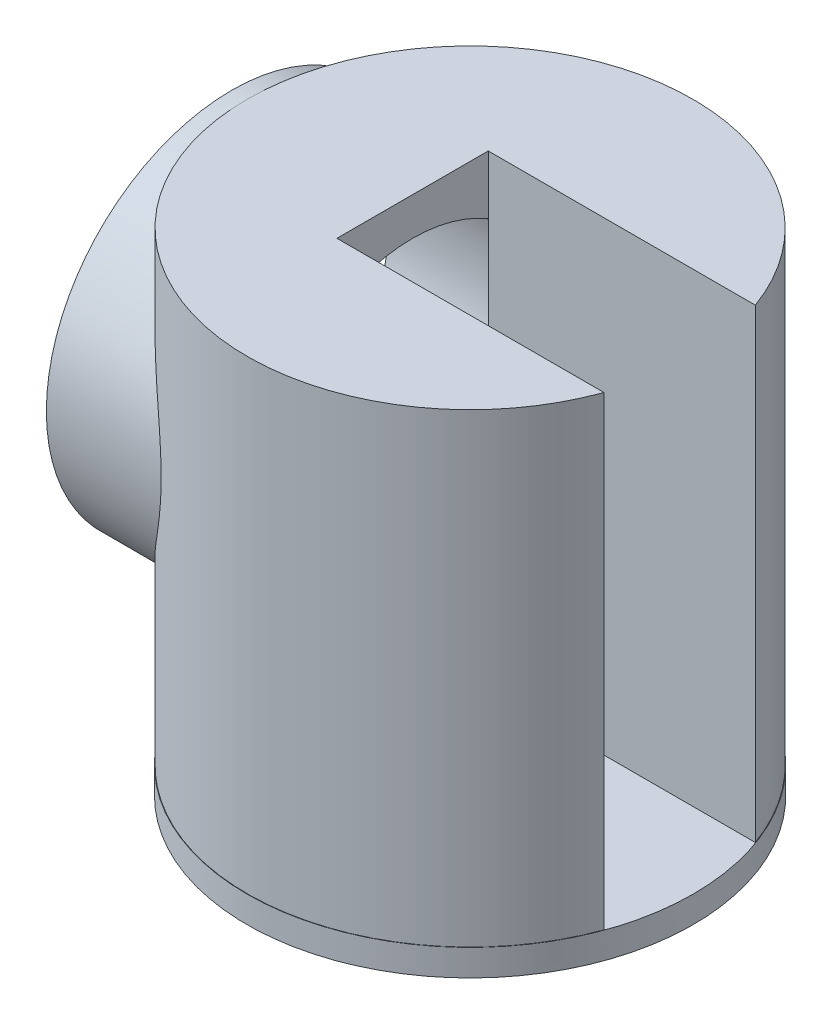
ISO-10303-21;
HEADER;
FILE_DESCRIPTION(('STEP AP214'),'2;1');
FILE_NAME('part.step','',(''),(''),'','','');
FILE_SCHEMA(('AUTOMOTIVE_DESIGN { 1 0 10303 214 1 1 1 1 }'));
ENDSEC;
DATA;
#1=APPLICATION_CONTEXT('core data for automotive mechanical design processes');
#2=APPLICATION_PROTOCOL_DEFINITION('international standard','automotive_design',2000,#1);
#3=PRODUCT_CONTEXT('',#1,'mechanical');
#4=PRODUCT('Part','Part','',(#3));
#5=PRODUCT_RELATED_PRODUCT_CATEGORY('part','',(#4));
#6=PRODUCT_DEFINITION_FORMATION('','',#4);
#7=PRODUCT_DEFINITION_CONTEXT('part definition',#1,'design');
#8=PRODUCT_DEFINITION('design','',#6,#7);
#9=PRODUCT_DEFINITION_SHAPE('','',#8);
#10=(LENGTH_UNIT() NAMED_UNIT(*) SI_UNIT(.MILLI.,.METRE.));
#11=(NAMED_UNIT(*) PLANE_ANGLE_UNIT() SI_UNIT($,.RADIAN.));
#12=(NAMED_UNIT(*) SI_UNIT($,.STERADIAN.) SOLID_ANGLE_UNIT());
#13=UNCERTAINTY_MEASURE_WITH_UNIT(LENGTH_MEASURE(1.E-05),#10,'distance_accuracy_value','');
#14=(GEOMETRIC_REPRESENTATION_CONTEXT(3) GLOBAL_UNCERTAINTY_ASSIGNED_CONTEXT((#13)) GLOBAL_UNIT_ASSIGNED_CONTEXT((#10,
#11,#12)) REPRESENTATION_CONTEXT('',''));
#15=CARTESIAN_POINT('',(0.,0.,0.));
#16=DIRECTION('',(0.,0.,1.));
#17=DIRECTION('',(1.,0.,0.));
#18=AXIS2_PLACEMENT_3D('',#15,#16,#17);
#19=CARTESIAN_POINT('',(0.,4.,0.));
#20=DIRECTION('',(0.,-1.,0.));
#21=DIRECTION('',(0.,0.,-1.));
#22=AXIS2_PLACEMENT_3D('',#19,#20,#21);
#23=CYLINDRICAL_SURFACE('',#22,29.5);
#24=CARTESIAN_POINT('',(0.,4.,0.));
#25=DIRECTION('',(0.,1.,0.));
#26=DIRECTION('',(0.,0.,1.));
#27=AXIS2_PLACEMENT_3D('',#24,#25,#26);
#28=CIRCLE('',#27,29.5);
#29=CARTESIAN_POINT('',(0.,4.,29.5));
#30=VERTEX_POINT('',#29);
#31=EDGE_CURVE('E186',#30,#30,#28,.T.);
#32=ORIENTED_EDGE('',*,*,#31,.F.);
#33=EDGE_LOOP('',(#32));
#34=FACE_BOUND('',#33,.T.);
#35=CARTESIAN_POINT('',(0.,0.5,0.));
#36=DIRECTION('',(0.,-1.,0.));
#37=DIRECTION('',(0.,0.,-1.));
#38=AXIS2_PLACEMENT_3D('',#35,#36,#37);
#39=CIRCLE('',#38,29.5);
#40=CARTESIAN_POINT('',(0.,0.5,-29.5));
#41=VERTEX_POINT('',#40);
#42=EDGE_CURVE('E241',#41,#41,#39,.T.);
#43=ORIENTED_EDGE('',*,*,#42,.F.);
#44=EDGE_LOOP('',(#43));
#45=FACE_BOUND('',#44,.T.);
#46=ADVANCED_FACE('F35',(#34,#45),#23,.T.);
#47=CARTESIAN_POINT('',(0.,0.,0.));
#48=DIRECTION('',(0.,1.,0.));
#49=DIRECTION('',(0.,0.,1.));
#50=AXIS2_PLACEMENT_3D('',#47,#48,#49);
#51=PLANE('',#50);
#52=CARTESIAN_POINT('',(7.,0.,0.));
#53=DIRECTION('',(0.,1.,0.));
#54=DIRECTION('',(0.,0.,1.));
#55=AXIS2_PLACEMENT_3D('',#52,#53,#54);
#56=CIRCLE('',#55,1.5);
#57=CARTESIAN_POINT('',(7.,0.,1.5));
#58=VERTEX_POINT('',#57);
#59=EDGE_CURVE('E183',#58,#58,#56,.T.);
#60=ORIENTED_EDGE('',*,*,#59,.T.);
#61=EDGE_LOOP('',(#60));
#62=FACE_BOUND('',#61,.T.);
#63=CARTESIAN_POINT('',(0.,0.,7.));
#64=DIRECTION('',(0.,1.,0.));
#65=DIRECTION('',(-1.,0.,0.));
#66=AXIS2_PLACEMENT_3D('',#63,#64,#65);
#67=CIRCLE('',#66,1.5);
#68=CARTESIAN_POINT('',(-1.49999999999993,0.,7.00000000000002));
#69=VERTEX_POINT('',#68);
#70=EDGE_CURVE('E171',#69,#69,#67,.T.);
#71=ORIENTED_EDGE('',*,*,#70,.T.);
#72=EDGE_LOOP('',(#71));
#73=FACE_BOUND('',#72,.T.);
#74=CARTESIAN_POINT('',(-7.,0.,0.));
#75=DIRECTION('',(0.,1.,0.));
#76=DIRECTION('',(0.,0.,-1.));
#77=AXIS2_PLACEMENT_3D('',#74,#75,#76);
#78=CIRCLE('',#77,1.5);
#79=CARTESIAN_POINT('',(-7.,0.,-1.5));
#80=VERTEX_POINT('',#79);
#81=EDGE_CURVE('E174',#80,#80,#78,.T.);
#82=ORIENTED_EDGE('',*,*,#81,.T.);
#83=EDGE_LOOP('',(#82));
#84=FACE_BOUND('',#83,.T.);
#85=CARTESIAN_POINT('',(0.,0.,-7.));
#86=DIRECTION('',(0.,1.,0.));
#87=DIRECTION('',(1.,0.,0.));
#88=AXIS2_PLACEMENT_3D('',#85,#86,#87);
#89=CIRCLE('',#88,1.5);
#90=CARTESIAN_POINT('',(1.49999999999998,0.,-7.00000000000001));
#91=VERTEX_POINT('',#90);
#92=EDGE_CURVE('E187',#91,#91,#89,.T.);
#93=ORIENTED_EDGE('',*,*,#92,.T.);
#94=EDGE_LOOP('',(#93));
#95=FACE_BOUND('',#94,.T.);
#96=CARTESIAN_POINT('',(0.,0.,0.));
#97=DIRECTION('',(0.,-1.,0.));
#98=DIRECTION('',(0.,0.,-1.));
#99=AXIS2_PLACEMENT_3D('',#96,#97,#98);
#100=CIRCLE('',#99,19.5);
#101=CARTESIAN_POINT('',(0.,0.,-19.5));
#102=VERTEX_POINT('',#101);
#103=EDGE_CURVE('E246',#102,#102,#100,.T.);
#104=ORIENTED_EDGE('',*,*,#103,.T.);
#105=EDGE_LOOP('',(#104));
#106=FACE_BOUND('',#105,.T.);
#107=ADVANCED_FACE('F230',(#62,#73,#84,#95,#106),#51,.F.);
#108=CARTESIAN_POINT('',(-7.6,4.,-10.));
#109=DIRECTION('',(-1.,0.,0.));
#110=DIRECTION('',(0.,0.,1.));
#111=AXIS2_PLACEMENT_3D('',#108,#109,#110);
#112=PLANE('',#111);
#113=DIRECTION('',(0.,1.,0.));
#114=VECTOR('',#113,1.);
#115=CARTESIAN_POINT('',(-7.6,4.,10.));
#116=LINE('',#115,#114);
#117=CARTESIAN_POINT('',(-7.6,57.7406690427832,10.));
#118=VERTEX_POINT('',#117);
#119=CARTESIAN_POINT('',(-7.6,65.5,10.));
#120=VERTEX_POINT('',#119);
#121=EDGE_CURVE('E133',#118,#120,#116,.T.);
#122=ORIENTED_EDGE('',*,*,#121,.F.);
#123=CARTESIAN_POINT('',(-7.6,41.,0.));
#124=DIRECTION('',(-1.,0.,0.));
#125=DIRECTION('',(0.,0.,1.));
#126=AXIS2_PLACEMENT_3D('',#123,#124,#125);
#127=CIRCLE('',#126,19.5);
#128=CARTESIAN_POINT('',(-7.6,57.7406690427832,-10.));
#129=VERTEX_POINT('',#128);
#130=EDGE_CURVE('E103',#129,#118,#127,.F.);
#131=ORIENTED_EDGE('',*,*,#130,.F.);
#132=DIRECTION('',(0.,1.,0.));
#133=VECTOR('',#132,1.);
#134=CARTESIAN_POINT('',(-7.6,4.,-10.));
#135=LINE('',#134,#133);
#136=CARTESIAN_POINT('',(-7.6,65.5,-10.));
#137=VERTEX_POINT('',#136);
#138=EDGE_CURVE('E118',#129,#137,#135,.T.);
#139=ORIENTED_EDGE('',*,*,#138,.T.);
#140=DIRECTION('',(0.,0.,1.));
#141=VECTOR('',#140,1.);
#142=CARTESIAN_POINT('',(-7.6,65.5,-10.));
#143=LINE('',#142,#141);
#144=EDGE_CURVE('E148',#137,#120,#143,.T.);
#145=ORIENTED_EDGE('',*,*,#144,.T.);
#146=EDGE_LOOP('',(#122,#131,#139,#145));
#147=FACE_BOUND('',#146,.T.);
#148=ADVANCED_FACE('F219',(#147),#112,.F.);
#149=CARTESIAN_POINT('',(0.,4.,0.));
#150=DIRECTION('',(0.,1.,0.));
#151=DIRECTION('',(0.,0.,1.));
#152=AXIS2_PLACEMENT_3D('',#149,#150,#151);
#153=PLANE('',#152);
#154=CARTESIAN_POINT('',(0.,4.,0.));
#155=DIRECTION('',(0.,1.,0.));
#156=DIRECTION('',(0.,0.,1.));
#157=AXIS2_PLACEMENT_3D('',#154,#155,#156);
#158=CIRCLE('',#157,29.4448697876526);
#159=CARTESIAN_POINT('',(27.6947712901157,4.,-10.));
#160=VERTEX_POINT('',#159);
#161=CARTESIAN_POINT('',(27.6947712901157,4.,10.));
#162=VERTEX_POINT('',#161);
#163=EDGE_CURVE('E192',#160,#162,#158,.T.);
#164=ORIENTED_EDGE('',*,*,#163,.F.);
#165=DIRECTION('',(-1.,0.,0.));
#166=VECTOR('',#165,1.);
#167=CARTESIAN_POINT('',(-7.6,4.,-10.));
#168=LINE('',#167,#166);
#169=CARTESIAN_POINT('',(-7.6,4.,-10.));
#170=VERTEX_POINT('',#169);
#171=EDGE_CURVE('E138',#160,#170,#168,.T.);
#172=ORIENTED_EDGE('',*,*,#171,.T.);
#173=DIRECTION('',(0.,0.,1.));
#174=VECTOR('',#173,1.);
#175=CARTESIAN_POINT('',(-7.6,4.,-10.));
#176=LINE('',#175,#174);
#177=CARTESIAN_POINT('',(-7.6,4.,-1.37477270848675));
#178=VERTEX_POINT('',#177);
#179=EDGE_CURVE('E122',#170,#178,#176,.T.);
#180=ORIENTED_EDGE('',*,*,#179,.T.);
#181=CARTESIAN_POINT('',(-7.,4.,0.));
#182=DIRECTION('',(0.,1.,0.));
#183=DIRECTION('',(0.,0.,-1.));
#184=AXIS2_PLACEMENT_3D('',#181,#182,#183);
#185=CIRCLE('',#184,1.5);
#186=CARTESIAN_POINT('',(-7.6,4.,1.37477270848675));
#187=VERTEX_POINT('',#186);
#188=EDGE_CURVE('E125',#187,#178,#185,.T.);
#189=ORIENTED_EDGE('',*,*,#188,.F.);
#190=CARTESIAN_POINT('',(-7.6,4.,10.));
#191=VERTEX_POINT('',#190);
#192=EDGE_CURVE('E152',#187,#191,#176,.T.);
#193=ORIENTED_EDGE('',*,*,#192,.T.);
#194=DIRECTION('',(1.,0.,0.));
#195=VECTOR('',#194,1.);
#196=CARTESIAN_POINT('',(-7.6,4.,10.));
#197=LINE('',#196,#195);
#198=EDGE_CURVE('E141',#191,#162,#197,.T.);
#199=ORIENTED_EDGE('',*,*,#198,.T.);
#200=EDGE_LOOP('',(#164,#172,#180,#189,#193,#199));
#201=FACE_BOUND('',#200,.T.);
#202=ORIENTED_EDGE('',*,*,#31,.T.);
#203=EDGE_LOOP('',(#202));
#204=FACE_BOUND('',#203,.T.);
#205=CARTESIAN_POINT('',(7.,4.,0.));
#206=DIRECTION('',(0.,1.,0.));
#207=DIRECTION('',(0.,0.,1.));
#208=AXIS2_PLACEMENT_3D('',#205,#206,#207);
#209=CIRCLE('',#208,1.5);
#210=CARTESIAN_POINT('',(7.,4.,1.5));
#211=VERTEX_POINT('',#210);
#212=EDGE_CURVE('E182',#211,#211,#209,.T.);
#213=ORIENTED_EDGE('',*,*,#212,.F.);
#214=EDGE_LOOP('',(#213));
#215=FACE_BOUND('',#214,.T.);
#216=CARTESIAN_POINT('',(0.,4.,7.));
#217=DIRECTION('',(0.,1.,0.));
#218=DIRECTION('',(-1.,0.,0.));
#219=AXIS2_PLACEMENT_3D('',#216,#217,#218);
#220=CIRCLE('',#219,1.5);
#221=CARTESIAN_POINT('',(-1.49999999999993,4.,7.00000000000002));
#222=VERTEX_POINT('',#221);
#223=EDGE_CURVE('E167',#222,#222,#220,.T.);
#224=ORIENTED_EDGE('',*,*,#223,.F.);
#225=EDGE_LOOP('',(#224));
#226=FACE_BOUND('',#225,.T.);
#227=CARTESIAN_POINT('',(0.,4.,-7.));
#228=DIRECTION('',(0.,1.,0.));
#229=DIRECTION('',(1.,0.,0.));
#230=AXIS2_PLACEMENT_3D('',#227,#228,#229);
#231=CIRCLE('',#230,1.5);
#232=CARTESIAN_POINT('',(1.49999999999998,4.,-7.00000000000001));
#233=VERTEX_POINT('',#232);
#234=EDGE_CURVE('E123',#233,#233,#231,.T.);
#235=ORIENTED_EDGE('',*,*,#234,.F.);
#236=EDGE_LOOP('',(#235));
#237=FACE_BOUND('',#236,.T.);
#238=ADVANCED_FACE('F160',(#201,#204,#215,#226,#237),#153,.T.);
#239=CARTESIAN_POINT('',(7.,0.,0.));
#240=DIRECTION('',(0.,1.,0.));
#241=DIRECTION('',(0.,0.,1.));
#242=AXIS2_PLACEMENT_3D('',#239,#240,#241);
#243=CYLINDRICAL_SURFACE('',#242,1.5);
#244=ORIENTED_EDGE('',*,*,#59,.F.);
#245=EDGE_LOOP('',(#244));
#246=FACE_BOUND('',#245,.T.);
#247=ORIENTED_EDGE('',*,*,#212,.T.);
#248=EDGE_LOOP('',(#247));
#249=FACE_BOUND('',#248,.T.);
#250=ADVANCED_FACE('F401',(#246,#249),#243,.F.);
#251=CARTESIAN_POINT('',(0.,0.,7.));
#252=DIRECTION('',(0.,1.,0.));
#253=DIRECTION('',(0.,0.,1.));
#254=AXIS2_PLACEMENT_3D('',#251,#252,#253);
#255=CYLINDRICAL_SURFACE('',#254,1.5);
#256=ORIENTED_EDGE('',*,*,#70,.F.);
#257=EDGE_LOOP('',(#256));
#258=FACE_BOUND('',#257,.T.);
#259=ORIENTED_EDGE('',*,*,#223,.T.);
#260=EDGE_LOOP('',(#259));
#261=FACE_BOUND('',#260,.T.);
#262=ADVANCED_FACE('F393',(#258,#261),#255,.F.);
#263=CARTESIAN_POINT('',(-7.,0.,0.));
#264=DIRECTION('',(0.,1.,0.));
#265=DIRECTION('',(0.,0.,1.));
#266=AXIS2_PLACEMENT_3D('',#263,#264,#265);
#267=CYLINDRICAL_SURFACE('',#266,1.5);
#268=ORIENTED_EDGE('',*,*,#81,.F.);
#269=EDGE_LOOP('',(#268));
#270=FACE_BOUND('',#269,.T.);
#271=EDGE_CURVE('E166',#178,#187,#185,.T.);
#272=ORIENTED_EDGE('',*,*,#271,.T.);
#273=ORIENTED_EDGE('',*,*,#188,.T.);
#274=EDGE_LOOP('',(#272,#273));
#275=FACE_BOUND('',#274,.T.);
#276=ADVANCED_FACE('F165',(#270,#275),#267,.F.);
#277=CARTESIAN_POINT('',(0.,0.,-7.));
#278=DIRECTION('',(0.,1.,0.));
#279=DIRECTION('',(0.,0.,1.));
#280=AXIS2_PLACEMENT_3D('',#277,#278,#279);
#281=CYLINDRICAL_SURFACE('',#280,1.5);
#282=ORIENTED_EDGE('',*,*,#92,.F.);
#283=EDGE_LOOP('',(#282));
#284=FACE_BOUND('',#283,.T.);
#285=ORIENTED_EDGE('',*,*,#234,.T.);
#286=EDGE_LOOP('',(#285));
#287=FACE_BOUND('',#286,.T.);
#288=ADVANCED_FACE('F222',(#284,#287),#281,.F.);
#289=CARTESIAN_POINT('',(0.,65.5,0.));
#290=DIRECTION('',(0.,1.,0.));
#291=DIRECTION('',(0.,0.,1.));
#292=AXIS2_PLACEMENT_3D('',#289,#290,#291);
#293=PLANE('',#292);
#294=DIRECTION('',(-1.,0.,0.));
#295=VECTOR('',#294,1.);
#296=CARTESIAN_POINT('',(-7.6,65.5,-10.));
#297=LINE('',#296,#295);
#298=CARTESIAN_POINT('',(27.6947712901157,65.5,-10.));
#299=VERTEX_POINT('',#298);
#300=EDGE_CURVE('E151',#299,#137,#297,.T.);
#301=ORIENTED_EDGE('',*,*,#300,.F.);
#302=CARTESIAN_POINT('',(0.,65.5,0.));
#303=DIRECTION('',(0.,1.,0.));
#304=DIRECTION('',(0.,0.,1.));
#305=AXIS2_PLACEMENT_3D('',#302,#303,#304);
#306=CIRCLE('',#305,29.4448697876526);
#307=CARTESIAN_POINT('',(-29.4448697876526,65.5,0.));
#308=VERTEX_POINT('',#307);
#309=EDGE_CURVE('E172',#299,#308,#306,.T.);
#310=ORIENTED_EDGE('',*,*,#309,.T.);
#311=CARTESIAN_POINT('',(27.6947712901157,65.5,10.));
#312=VERTEX_POINT('',#311);
#313=EDGE_CURVE('E177',#308,#312,#306,.T.);
#314=ORIENTED_EDGE('',*,*,#313,.T.);
#315=DIRECTION('',(1.,0.,0.));
#316=VECTOR('',#315,1.);
#317=CARTESIAN_POINT('',(-7.6,65.5,10.));
#318=LINE('',#317,#316);
#319=EDGE_CURVE('E150',#120,#312,#318,.T.);
#320=ORIENTED_EDGE('',*,*,#319,.F.);
#321=ORIENTED_EDGE('',*,*,#144,.F.);
#322=EDGE_LOOP('',(#301,#310,#314,#320,#321));
#323=FACE_BOUND('',#322,.T.);
#324=ADVANCED_FACE('F220',(#323),#293,.T.);
#325=CARTESIAN_POINT('',(0.,65.5,0.));
#326=DIRECTION('',(0.,-1.,0.));
#327=DIRECTION('',(0.,0.,-1.));
#328=AXIS2_PLACEMENT_3D('',#325,#326,#327);
#329=CYLINDRICAL_SURFACE('',#328,29.4448697876526);
#330=ORIENTED_EDGE('',*,*,#313,.F.);
#331=CARTESIAN_POINT('',(-16.3324938944368,41.,-24.5));
#332=CARTESIAN_POINT('',(-16.3324868350606,41.4343736320815,-24.5000027558442));
#333=CARTESIAN_POINT('',(-16.3499012151454,41.8687157237052,-24.4884219230178));
#334=CARTESIAN_POINT('',(-16.4185693250994,42.7334437832875,-24.4424350682684));
#335=CARTESIAN_POINT('',(-16.4698214758377,43.1638299349103,-24.4080301114942));
#336=CARTESIAN_POINT('',(-16.6036947655676,44.0184525116976,-24.3171579369022));
#337=CARTESIAN_POINT('',(-16.6863999678811,44.4426692657286,-24.2606315842476));
#338=CARTESIAN_POINT('',(-16.8793945321836,45.2813926967697,-24.1267517593695));
#339=CARTESIAN_POINT('',(-16.9896889415598,45.6958975818215,-24.0493944759728));
#340=CARTESIAN_POINT('',(-17.2808170345677,46.671790280637,-23.8414934266433));
#341=CARTESIAN_POINT('',(-17.4724394182634,47.2280439796226,-23.7019483076602));
#342=CARTESIAN_POINT('',(-17.889762621723,48.3175791593523,-23.3885612895738));
#343=CARTESIAN_POINT('',(-18.1154793081905,48.8508497950092,-23.2147034104909));
#344=CARTESIAN_POINT('',(-18.5921580259387,49.8957681562001,-22.8347351210409));
#345=CARTESIAN_POINT('',(-18.8431824529057,50.4073577928781,-22.6285442639849));
#346=CARTESIAN_POINT('',(-19.3622721848877,51.408174922407,-22.1860143439487));
#347=CARTESIAN_POINT('',(-19.6303368940651,51.8974031961276,-21.9496763348159));
#348=CARTESIAN_POINT('',(-20.2981591723499,53.0659149731083,-21.3370795035876));
#349=CARTESIAN_POINT('',(-20.7037756872602,53.7336734171499,-20.945133927653));
#350=CARTESIAN_POINT('',(-21.5228931517232,55.026187073332,-20.1025196774559));
#351=CARTESIAN_POINT('',(-21.9363973800578,55.6509238817724,-19.651826107676));
#352=CARTESIAN_POINT('',(-22.7591925991343,56.8563594590526,-18.6927388757427));
#353=CARTESIAN_POINT('',(-23.1684868435629,57.4370948564531,-18.1843941049612));
#354=CARTESIAN_POINT('',(-23.9729507096775,58.5528111080674,-17.1098871990638));
#355=CARTESIAN_POINT('',(-24.3681256075523,59.0878091599671,-16.5437469728538));
#356=CARTESIAN_POINT('',(-25.0537491892029,60.0002682761096,-15.4797141582886));
#357=CARTESIAN_POINT('',(-25.3486662889476,60.3871122126066,-14.9927232070239));
#358=CARTESIAN_POINT('',(-25.9192221439883,61.1273782576192,-13.9832158266857));
#359=CARTESIAN_POINT('',(-26.1948616529984,61.4808016729987,-13.4607007881078));
#360=CARTESIAN_POINT('',(-26.7217493011036,62.1505121158882,-12.3817780592763));
#361=CARTESIAN_POINT('',(-26.9730294716407,62.466848029725,-11.8254164876056));
#362=CARTESIAN_POINT('',(-27.4467639539159,63.0591498248251,-10.6798609123464));
#363=CARTESIAN_POINT('',(-27.6692234762072,63.3351230045292,-10.0906728711554));
#364=CARTESIAN_POINT('',(-28.0450386924721,63.7988802942441,-8.98639410208584));
#365=CARTESIAN_POINT('',(-28.2036960280259,63.9936658188542,-8.47604019162561));
#366=CARTESIAN_POINT('',(-28.4953431608327,64.35047747553,-7.4368596802448));
#367=CARTESIAN_POINT('',(-28.6283356607315,64.512507057059,-6.90803503132672));
#368=CARTESIAN_POINT('',(-28.8661785952631,64.8015261924595,-5.83489469012575));
#369=CARTESIAN_POINT('',(-28.9710398762782,64.9285292518244,-5.29058505808388));
#370=CARTESIAN_POINT('',(-29.1506029507561,65.1456211584113,-4.18971358350554));
#371=CARTESIAN_POINT('',(-29.2253043966333,65.2357095802003,-3.63315159984133));
#372=CARTESIAN_POINT('',(-29.3432027491359,65.3777515401161,-2.50943770159915));
#373=CARTESIAN_POINT('',(-29.3862653721127,65.4295425396443,-1.94225100822475));
#374=CARTESIAN_POINT('',(-29.4394009835806,65.4934336059671,-0.804092935266779));
#375=CARTESIAN_POINT('',(-29.4494739031893,65.5055335898871,-0.233121547783275));
#376=CARTESIAN_POINT('',(-29.4364000645573,65.4898205337062,0.907861724772583));
#377=CARTESIAN_POINT('',(-29.4132546334632,65.4620090881555,1.4778736472668));
#378=CARTESIAN_POINT('',(-29.3342728936965,65.3669839723921,2.6122897594926));
#379=CARTESIAN_POINT('',(-29.2784376955808,65.2997716407306,3.17669413906471));
#380=CARTESIAN_POINT('',(-29.140105908769,65.1329117663784,4.25812900927584));
#381=CARTESIAN_POINT('',(-29.059640046326,65.0357315359018,4.77580507869089));
#382=CARTESIAN_POINT('',(-28.872803417357,64.8095041561241,5.79932714625268));
#383=CARTESIAN_POINT('',(-28.7664340519671,64.6804587304253,6.30517378263912));
#384=CARTESIAN_POINT('',(-28.5295858534987,64.3921710002424,7.30245386785323));
#385=CARTESIAN_POINT('',(-28.3991033446092,64.2329240917426,7.79388510594313));
#386=CARTESIAN_POINT('',(-28.1160884044505,63.88611179568,8.76010319961833));
#387=CARTESIAN_POINT('',(-27.9635546744675,63.698544740164,9.23488907282168));
#388=CARTESIAN_POINT('',(-27.6246213014691,63.2797165225689,10.2062508785072));
#389=CARTESIAN_POINT('',(-27.4364360967933,63.0460830653164,10.7011795236557));
#390=CARTESIAN_POINT('',(-27.0395157972393,62.5501083682721,11.667818945041));
#391=CARTESIAN_POINT('',(-26.8307797460717,62.2877657924999,12.1395286393005));
#392=CARTESIAN_POINT('',(-26.3956056266241,61.736592295025,13.0587516080008));
#393=CARTESIAN_POINT('',(-26.1691646239942,61.4477569811398,13.5062608506734));
#394=CARTESIAN_POINT('',(-25.7014299521621,60.8456314893883,14.3764012456967));
#395=CARTESIAN_POINT('',(-25.4601341937889,60.5323378700401,14.7990288822749));
#396=CARTESIAN_POINT('',(-24.9141555169177,59.8156682649091,15.7041219860796));
#397=CARTESIAN_POINT('',(-24.6067088624028,59.407089229174,16.180807641879));
#398=CARTESIAN_POINT('',(-23.9790981731339,58.5592730842182,17.0971247154017));
#399=CARTESIAN_POINT('',(-23.6589322672018,58.1200314568544,17.5367506512047));
#400=CARTESIAN_POINT('',(-23.0103615653935,57.2119585835818,18.3795192125211));
#401=CARTESIAN_POINT('',(-22.681944836259,56.743082793171,18.7826045867381));
#402=CARTESIAN_POINT('',(-22.0226524251172,55.7773953982154,19.5514587377798));
#403=CARTESIAN_POINT('',(-21.6917769081917,55.2805856546968,19.9172299960008));
#404=CARTESIAN_POINT('',(-21.0288065527588,54.2520651048868,20.6161293287408));
#405=CARTESIAN_POINT('',(-20.6967597984489,53.7199622695487,20.9487270938373));
#406=CARTESIAN_POINT('',(-20.0433714238444,52.6266363576698,21.5747150927527));
#407=CARTESIAN_POINT('',(-19.7220324815772,52.0654060847832,21.8680955727522));
#408=CARTESIAN_POINT('',(-19.0996379441532,50.9136469784646,22.4137216206577));
#409=CARTESIAN_POINT('',(-18.7985487575278,50.3231696370669,22.6660363504603));
#410=CARTESIAN_POINT('',(-18.370623544561,49.4143062820584,23.012048021122));
#411=CARTESIAN_POINT('',(-18.2319641073622,49.107571427132,23.1219523658515));
#412=CARTESIAN_POINT('',(-17.9642260666969,48.4861053648162,23.3305744127926));
#413=CARTESIAN_POINT('',(-17.8351493391293,48.1713726078692,23.4292899266748));
#414=CARTESIAN_POINT('',(-17.5613591308083,47.4637134372229,23.6354503188718));
#415=CARTESIAN_POINT('',(-17.4194692162548,47.0688414373319,23.7400240508952));
#416=CARTESIAN_POINT('',(-17.1568413574762,46.2678170520675,23.9305137512167));
#417=CARTESIAN_POINT('',(-17.0360958605684,45.861668754836,24.0164363842343));
#418=CARTESIAN_POINT('',(-16.8200496092913,45.039856957356,24.168237953743));
#419=CARTESIAN_POINT('',(-16.7246949520528,44.6242156814835,24.2341593934787));
#420=CARTESIAN_POINT('',(-16.5630340394574,43.7844873186263,24.3449361709819));
#421=CARTESIAN_POINT('',(-16.4967269617965,43.3604004710815,24.3897921050927));
#422=CARTESIAN_POINT('',(-16.3958572019285,42.5023292984462,24.4577189451927));
#423=CARTESIAN_POINT('',(-16.3616196490191,42.0682883625503,24.4805667919634));
#424=CARTESIAN_POINT('',(-16.3279134476177,41.198260820633,24.5030616278361));
#425=CARTESIAN_POINT('',(-16.3284428687369,40.7622743239802,24.5027099050626));
#426=CARTESIAN_POINT('',(-16.3642505308456,39.892075418771,24.4788093190325));
#427=CARTESIAN_POINT('',(-16.3995538855177,39.4578645201301,24.4552436907272));
#428=CARTESIAN_POINT('',(-16.5030221806612,38.595227269756,24.3855375849362));
#429=CARTESIAN_POINT('',(-16.5711921466737,38.1668018129607,24.3393936550498));
#430=CARTESIAN_POINT('',(-16.7508343612203,37.2483077131699,24.2161853055902));
#431=CARTESIAN_POINT('',(-16.8676133600958,36.7598005555672,24.1352618434537));
#432=CARTESIAN_POINT('',(-17.1348173233291,35.7975374635437,23.9462952738852));
#433=CARTESIAN_POINT('',(-17.285250507906,35.32378516534,23.8382455399237));
#434=CARTESIAN_POINT('',(-17.6135344150988,34.3911114999454,23.5967229758107));
#435=CARTESIAN_POINT('',(-17.7914598028576,33.9322347659933,23.4631806714976));
#436=CARTESIAN_POINT('',(-18.1683333727117,33.030967105235,23.1725856676397));
#437=CARTESIAN_POINT('',(-18.3672829669719,32.5885772885338,23.0155313885349));
#438=CARTESIAN_POINT('',(-18.9018811148589,31.4659584857569,22.5809017083902));
#439=CARTESIAN_POINT('',(-19.2494548110443,30.7978687644583,22.2865418604976));
#440=CARTESIAN_POINT('',(-19.967597076763,29.5001559530627,21.6454996244027));
#441=CARTESIAN_POINT('',(-20.3381783002892,28.870554415826,21.2987882903917));
#442=CARTESIAN_POINT('',(-21.0902576285768,27.6478075669172,20.5543612251199));
#443=CARTESIAN_POINT('',(-21.4717690708596,27.0547098403015,20.1565809217027));
#444=CARTESIAN_POINT('',(-22.2351890140702,25.9057178863783,19.3111684724051));
#445=CARTESIAN_POINT('',(-22.6170974217237,25.3498163362682,18.8635461854067));
#446=CARTESIAN_POINT('',(-23.3873449828982,24.2556239891021,17.9004747841974));
#447=CARTESIAN_POINT('',(-23.7753741561452,23.7188127262998,17.383090334894));
#448=CARTESIAN_POINT('',(-24.5341802202531,22.688890119623,16.2946231166045));
#449=CARTESIAN_POINT('',(-24.9049541557527,22.1957862486699,15.7235311991921));
#450=CARTESIAN_POINT('',(-25.6199469406199,21.2586017515612,14.529333141032));
#451=CARTESIAN_POINT('',(-25.9642271502039,20.8144067549331,13.9063546017233));
#452=CARTESIAN_POINT('',(-26.4548129085934,20.1883816029561,12.9334924127912));
#453=CARTESIAN_POINT('',(-26.6140157278018,19.9864426420842,12.6028537967298));
#454=CARTESIAN_POINT('',(-26.9228428012236,19.5966527806159,11.9288849529837));
#455=CARTESIAN_POINT('',(-27.0724647855571,19.4088052167418,11.5855517478816));
#456=CARTESIAN_POINT('',(-27.4192703771012,18.975260818521,10.7454914079844));
#457=CARTESIAN_POINT('',(-27.6112578025347,18.7368402790397,10.2428143229895));
#458=CARTESIAN_POINT('',(-27.9710053693263,18.2922074065825,9.21517755612285));
#459=CARTESIAN_POINT('',(-28.1387717680808,18.0859867537801,8.69022367487395));
#460=CARTESIAN_POINT('',(-28.4471309385928,17.7083538752267,7.62041831954068));
#461=CARTESIAN_POINT('',(-28.5877363493362,17.5369254575058,7.0755762411693));
#462=CARTESIAN_POINT('',(-28.8391416857103,17.2312537687319,5.96877527181329));
#463=CARTESIAN_POINT('',(-28.9499408601437,17.0970114348656,5.40681594982535));
#464=CARTESIAN_POINT('',(-29.1399675384821,16.8672099127443,4.26603168869031));
#465=CARTESIAN_POINT('',(-29.2189955962481,16.7718950377061,3.68712395203599));
#466=CARTESIAN_POINT('',(-29.3426740951307,16.6228816854202,2.52031273356766));
#467=CARTESIAN_POINT('',(-29.3873245865531,16.5691831472737,1.93240926491873));
#468=CARTESIAN_POINT('',(-29.4411651304869,16.5044458949107,0.75277694756192));
#469=CARTESIAN_POINT('',(-29.4503639620265,16.4933966192954,0.161049082264566));
#470=CARTESIAN_POINT('',(-29.4330949288112,16.5141518835496,-1.02110507249352));
#471=CARTESIAN_POINT('',(-29.406629491029,16.5459535073925,-1.61153144778276));
#472=CARTESIAN_POINT('',(-29.3228589194006,16.6467581665972,-2.73032182212983));
#473=CARTESIAN_POINT('',(-29.268707937772,16.7119575030826,-3.2592732770227));
#474=CARTESIAN_POINT('',(-29.1327766570499,16.8759368245591,-4.30829068853768));
#475=CARTESIAN_POINT('',(-29.0509984604508,16.974714254184,-4.82835731815219));
#476=CARTESIAN_POINT('',(-28.8613064704851,17.2044363686644,-5.85650884327322));
#477=CARTESIAN_POINT('',(-28.753389420801,17.3353850613702,-6.36459223727519));
#478=CARTESIAN_POINT('',(-28.5132783477798,17.6277165495001,-7.36603738908229));
#479=CARTESIAN_POINT('',(-28.3810829404658,17.7891010799199,-7.85939830577436));
#480=CARTESIAN_POINT('',(-28.0879020019384,18.148497163907,-8.85154752194967));
#481=CARTESIAN_POINT('',(-27.9258703929571,18.3478539800716,-9.34953802022289));
#482=CARTESIAN_POINT('',(-27.5800918300853,18.7755327892178,-10.3250543501891));
#483=CARTESIAN_POINT('',(-27.3963448391704,19.0038548315845,-10.8025801469883));
#484=CARTESIAN_POINT('',(-27.009744514278,19.4872824909274,-11.7358064082162));
#485=CARTESIAN_POINT('',(-26.8068908963011,19.7423885060249,-12.1915065480783));
#486=CARTESIAN_POINT('',(-26.3846728982933,20.2773657626987,-13.0801963699587));
#487=CARTESIAN_POINT('',(-26.1653052264845,20.5572419437228,-13.5131814948071));
#488=CARTESIAN_POINT('',(-25.6068263166276,21.2761095124452,-14.5527701507862));
#489=CARTESIAN_POINT('',(-25.2596604446475,21.7283410294523,-15.1459593202783));
#490=CARTESIAN_POINT('',(-24.5432559724686,22.6773900392474,-16.2812731991177));
#491=CARTESIAN_POINT('',(-24.1740085990014,23.1742252935083,-16.8233773884238));
#492=CARTESIAN_POINT('',(-23.4199825472443,24.2109430712746,-17.8582234903329));
#493=CARTESIAN_POINT('',(-23.0351481546196,24.7509882731445,-18.3507614240352));
#494=CARTESIAN_POINT('',(-22.2598013321609,25.8701809380089,-19.2839164450979));
#495=CARTESIAN_POINT('',(-21.8692898086396,26.4493222122371,-19.7245417198699));
#496=CARTESIAN_POINT('',(-21.0849976481638,27.6567813453297,-20.5610725357217));
#497=CARTESIAN_POINT('',(-20.6912830744314,28.2857924551239,-20.9560394866208));
#498=CARTESIAN_POINT('',(-19.919320727227,29.5849780796084,-21.691120860443));
#499=CARTESIAN_POINT('',(-19.5410809585188,30.255173460521,-22.0312071560854));
#500=CARTESIAN_POINT('',(-18.9982426603582,31.2908156896844,-22.4971987338318));
#501=CARTESIAN_POINT('',(-18.821732862195,31.6403129475541,-22.6449054512997));
#502=CARTESIAN_POINT('',(-18.4790070082796,32.350140482663,-22.925438330319));
#503=CARTESIAN_POINT('',(-18.3127917303369,32.710471575412,-23.0582633680869));
#504=CARTESIAN_POINT('',(-17.834019470323,33.8073270053816,-23.4331308014417));
#505=CARTESIAN_POINT('',(-17.5407085668567,34.5608744479678,-23.6520930901786));
#506=CARTESIAN_POINT('',(-17.1393177572344,35.7859228219318,-23.9432200895429));
#507=CARTESIAN_POINT('',(-17.0050854042494,36.2435077183335,-24.0384727048835));
#508=CARTESIAN_POINT('',(-16.769195239428,37.171586586439,-24.2036188158823));
#509=CARTESIAN_POINT('',(-16.6675305418906,37.6420778065222,-24.2735176724386));
#510=CARTESIAN_POINT('',(-16.5025936799999,38.5911450643812,-24.3859550491616));
#511=CARTESIAN_POINT('',(-16.4391730637392,39.069682331591,-24.428599402145));
#512=CARTESIAN_POINT('',(-16.3541302924564,40.0321600041,-24.4856181854423));
#513=CARTESIAN_POINT('',(-16.3325017587151,40.5160995735043,-24.4999969299375));
#514=CARTESIAN_POINT('',(-16.3324938944368,41.,-24.5));
#515=B_SPLINE_CURVE_WITH_KNOTS('',3,(#331,#332,#333,#334,#335,#336,#337,#338,#339,#340,#341,
#342,#343,#344,#345,#346,#347,#348,#349,#350,#351,#352,#353,#354,#355,#356,#357,#358,#359,#360,
#361,#362,#363,#364,#365,#366,#367,#368,#369,#370,#371,#372,#373,#374,#375,#376,#377,#378,#379,
#380,#381,#382,#383,#384,#385,#386,#387,#388,#389,#390,#391,#392,#393,#394,#395,#396,#397,#398,
#399,#400,#401,#402,#403,#404,#405,#406,#407,#408,#409,#410,#411,#412,#413,#414,#415,#416,#417,
#418,#419,#420,#421,#422,#423,#424,#425,#426,#427,#428,#429,#430,#431,#432,#433,#434,#435,#436,
#437,#438,#439,#440,#441,#442,#443,#444,#445,#446,#447,#448,#449,#450,#451,#452,#453,#454,#455,
#456,#457,#458,#459,#460,#461,#462,#463,#464,#465,#466,#467,#468,#469,#470,#471,#472,#473,#474,
#475,#476,#477,#478,#479,#480,#481,#482,#483,#484,#485,#486,#487,#488,#489,#490,#491,#492,#493,
#494,#495,#496,#497,#498,#499,#500,#501,#502,#503,#504,#505,#506,#507,#508,#509,#510,#511,#512,
#513,#514),.UNSPECIFIED.,.T.,.F.,(4,2,2,2,2,2,2,2,2,2,2,2,2,2,2,2,2,2,2,2,2,2,2,2,2,2,2,2,2,2,2,
2,2,2,2,2,2,2,2,2,2,2,2,2,2,2,2,2,2,2,2,2,2,2,2,2,2,2,2,2,2,2,2,2,2,2,2,2,2,2,2,2,2,2,2,2,2,2,2,
2,2,2,2,2,2,2,2,2,2,2,2,4),(0.,1.30257715899405,2.6050935340139,3.91111584003376,
5.21737725505422,7.02839346779443,8.84025509734027,10.6566984631976,12.4730783494343,
15.0919374425844,17.7119099543204,20.32967697049,22.9464553114549,25.0096125896223,
27.0726891574489,29.133014987797,31.1929678055939,32.8977929193942,34.6024384078169,
36.3064256987819,38.0104326272693,39.721630686628,41.4328323189625,43.1439655869034,
44.8550407265394,46.4517861946082,48.0484453129268,49.6453480272642,51.2423448300481,
52.9769421833377,54.7116202905671,56.4465865085194,58.1817972918235,60.2770553041563,
62.3726227078092,64.4714186355996,66.5700749019311,68.6981912996587,70.8268360051149,
72.9518577497581,74.0138516779203,75.0760529554378,76.3723596572647,77.6682023759669,
78.9612717788284,80.2543045739915,81.5603089299065,82.8662407717758,84.1731164476793,
85.4801920176693,87.0040564972244,88.5282935961921,90.0567455401626,91.5853002133216,
94.007394090004,96.4308321108949,98.857365100682,101.283418965332,103.801970690745,
106.32095220113,108.833912181051,110.090048628987,111.346481586486,113.110348517628,
114.87375894289,116.636346802553,118.398979080011,120.172509857534,121.946038039778,
123.719127008321,125.492095323305,127.097347090704,128.702476722281,130.307806420119,
131.913227657489,133.592639094173,135.272053394259,136.951492660967,138.631267584475,
141.095969256855,143.561656778678,146.037108571239,148.512169423485,151.031408056864,
153.551933770652,154.806871920027,156.061904771723,158.567725656335,160.025043753252,
161.482053529238,162.933370606968,164.384466152893),.UNSPECIFIED.);
#516=EDGE_CURVE('E57',#308,#308,#515,.T.);
#517=ORIENTED_EDGE('',*,*,#516,.T.);
#518=ORIENTED_EDGE('',*,*,#309,.F.);
#519=DIRECTION('',(0.,-1.,0.));
#520=VECTOR('',#519,1.);
#521=CARTESIAN_POINT('',(27.6947712901157,65.5,-10.));
#522=LINE('',#521,#520);
#523=EDGE_CURVE('E11',#299,#160,#522,.T.);
#524=ORIENTED_EDGE('',*,*,#523,.T.);
#525=ORIENTED_EDGE('',*,*,#163,.T.);
#526=DIRECTION('',(0.,-1.,0.));
#527=VECTOR('',#526,1.);
#528=CARTESIAN_POINT('',(27.6947712901157,65.5,10.));
#529=LINE('',#528,#527);
#530=EDGE_CURVE('E43',#162,#312,#529,.F.);
#531=ORIENTED_EDGE('',*,*,#530,.T.);
#532=EDGE_LOOP('',(#330,#517,#518,#524,#525,#531));
#533=FACE_BOUND('',#532,.T.);
#534=ADVANCED_FACE('F199',(#533),#329,.T.);
#535=CARTESIAN_POINT('',(0.,4.,0.));
#536=DIRECTION('',(0.,1.,0.));
#537=DIRECTION('',(0.,0.,1.));
#538=AXIS2_PLACEMENT_3D('',#535,#536,#537);
#539=PLANE('',#538);
#540=ORIENTED_EDGE('',*,*,#271,.F.);
#541=EDGE_CURVE('E155',#178,#187,#176,.T.);
#542=ORIENTED_EDGE('',*,*,#541,.T.);
#543=EDGE_LOOP('',(#540,#542));
#544=FACE_BOUND('',#543,.T.);
#545=ADVANCED_FACE('F170',(#544),#539,.F.);
#546=CARTESIAN_POINT('',(-7.6,4.,-10.));
#547=DIRECTION('',(0.,0.,-1.));
#548=DIRECTION('',(-1.,0.,0.));
#549=AXIS2_PLACEMENT_3D('',#546,#547,#548);
#550=PLANE('',#549);
#551=ORIENTED_EDGE('',*,*,#300,.T.);
#552=ORIENTED_EDGE('',*,*,#138,.F.);
#553=CARTESIAN_POINT('',(-7.6,24.2593309572168,-10.));
#554=VERTEX_POINT('',#553);
#555=EDGE_CURVE('E100',#554,#129,#135,.T.);
#556=ORIENTED_EDGE('',*,*,#555,.F.);
#557=EDGE_CURVE('E116',#170,#554,#135,.T.);
#558=ORIENTED_EDGE('',*,*,#557,.F.);
#559=ORIENTED_EDGE('',*,*,#171,.F.);
#560=ORIENTED_EDGE('',*,*,#523,.F.);
#561=EDGE_LOOP('',(#551,#552,#556,#558,#559,#560));
#562=FACE_BOUND('',#561,.T.);
#563=ADVANCED_FACE('F115',(#562),#550,.F.);
#564=CARTESIAN_POINT('',(-7.6,4.,10.));
#565=DIRECTION('',(0.,0.,1.));
#566=DIRECTION('',(1.,0.,0.));
#567=AXIS2_PLACEMENT_3D('',#564,#565,#566);
#568=PLANE('',#567);
#569=ORIENTED_EDGE('',*,*,#198,.F.);
#570=CARTESIAN_POINT('',(-7.6,24.2593309572168,10.));
#571=VERTEX_POINT('',#570);
#572=EDGE_CURVE('E129',#191,#571,#116,.T.);
#573=ORIENTED_EDGE('',*,*,#572,.T.);
#574=EDGE_CURVE('E132',#571,#118,#116,.T.);
#575=ORIENTED_EDGE('',*,*,#574,.T.);
#576=ORIENTED_EDGE('',*,*,#121,.T.);
#577=ORIENTED_EDGE('',*,*,#319,.T.);
#578=ORIENTED_EDGE('',*,*,#530,.F.);
#579=EDGE_LOOP('',(#569,#573,#575,#576,#577,#578));
#580=FACE_BOUND('',#579,.T.);
#581=ADVANCED_FACE('F214',(#580),#568,.F.);
#582=ORIENTED_EDGE('',*,*,#557,.T.);
#583=EDGE_CURVE('E102',#571,#554,#127,.F.);
#584=ORIENTED_EDGE('',*,*,#583,.F.);
#585=ORIENTED_EDGE('',*,*,#572,.F.);
#586=ORIENTED_EDGE('',*,*,#192,.F.);
#587=ORIENTED_EDGE('',*,*,#541,.F.);
#588=ORIENTED_EDGE('',*,*,#179,.F.);
#589=EDGE_LOOP('',(#582,#584,#585,#586,#587,#588));
#590=FACE_BOUND('',#589,.T.);
#591=ADVANCED_FACE('F120',(#590),#112,.F.);
#592=CARTESIAN_POINT('',(-31.5,41.,0.));
#593=DIRECTION('',(1.,0.,0.));
#594=DIRECTION('',(0.,0.,-1.));
#595=AXIS2_PLACEMENT_3D('',#592,#593,#594);
#596=CYLINDRICAL_SURFACE('',#595,24.5);
#597=CARTESIAN_POINT('',(-31.5,41.,0.));
#598=DIRECTION('',(1.,0.,0.));
#599=DIRECTION('',(0.,0.,-1.));
#600=AXIS2_PLACEMENT_3D('',#597,#598,#599);
#601=CIRCLE('',#600,24.5);
#602=CARTESIAN_POINT('',(-31.5,41.,-24.5));
#603=VERTEX_POINT('',#602);
#604=EDGE_CURVE('E198',#603,#603,#601,.T.);
#605=ORIENTED_EDGE('',*,*,#604,.T.);
#606=EDGE_LOOP('',(#605));
#607=FACE_BOUND('',#606,.T.);
#608=ORIENTED_EDGE('',*,*,#516,.F.);
#609=EDGE_LOOP('',(#608));
#610=FACE_BOUND('',#609,.T.);
#611=ADVANCED_FACE('F203',(#607,#610),#596,.T.);
#612=CARTESIAN_POINT('',(-31.5,41.,0.));
#613=DIRECTION('',(1.,0.,0.));
#614=DIRECTION('',(0.,0.,-1.));
#615=AXIS2_PLACEMENT_3D('',#612,#613,#614);
#616=CYLINDRICAL_SURFACE('',#615,21.);
#617=CARTESIAN_POINT('',(-31.5,41.,0.));
#618=DIRECTION('',(1.,0.,0.));
#619=DIRECTION('',(0.,0.,-1.));
#620=AXIS2_PLACEMENT_3D('',#617,#618,#619);
#621=CIRCLE('',#620,21.);
#622=CARTESIAN_POINT('',(-31.5,41.,-21.));
#623=VERTEX_POINT('',#622);
#624=EDGE_CURVE('E253',#623,#623,#621,.T.);
#625=ORIENTED_EDGE('',*,*,#624,.F.);
#626=EDGE_LOOP('',(#625));
#627=FACE_BOUND('',#626,.T.);
#628=CARTESIAN_POINT('',(-14.5,41.,0.));
#629=DIRECTION('',(-1.,0.,0.));
#630=DIRECTION('',(0.,0.,1.));
#631=AXIS2_PLACEMENT_3D('',#628,#629,#630);
#632=CIRCLE('',#631,21.);
#633=CARTESIAN_POINT('',(-14.5,41.,21.));
#634=VERTEX_POINT('',#633);
#635=EDGE_CURVE('E250',#634,#634,#632,.T.);
#636=ORIENTED_EDGE('',*,*,#635,.F.);
#637=EDGE_LOOP('',(#636));
#638=FACE_BOUND('',#637,.T.);
#639=ADVANCED_FACE('F208',(#627,#638),#616,.F.);
#640=CARTESIAN_POINT('',(-31.5,41.,0.));
#641=DIRECTION('',(1.,0.,0.));
#642=DIRECTION('',(0.,0.,-1.));
#643=AXIS2_PLACEMENT_3D('',#640,#641,#642);
#644=PLANE('',#643);
#645=ORIENTED_EDGE('',*,*,#624,.T.);
#646=EDGE_LOOP('',(#645));
#647=FACE_BOUND('',#646,.T.);
#648=ORIENTED_EDGE('',*,*,#604,.F.);
#649=EDGE_LOOP('',(#648));
#650=FACE_BOUND('',#649,.T.);
#651=ADVANCED_FACE('F210',(#647,#650),#644,.F.);
#652=CARTESIAN_POINT('',(-14.5,41.,0.));
#653=DIRECTION('',(-1.,0.,0.));
#654=DIRECTION('',(0.,0.,1.));
#655=AXIS2_PLACEMENT_3D('',#652,#653,#654);
#656=PLANE('',#655);
#657=CARTESIAN_POINT('',(-14.5,41.,0.));
#658=DIRECTION('',(-1.,0.,0.));
#659=DIRECTION('',(0.,0.,1.));
#660=AXIS2_PLACEMENT_3D('',#657,#658,#659);
#661=CIRCLE('',#660,19.5);
#662=CARTESIAN_POINT('',(-14.5,41.,19.5));
#663=VERTEX_POINT('',#662);
#664=EDGE_CURVE('E38',#663,#663,#661,.T.);
#665=ORIENTED_EDGE('',*,*,#664,.F.);
#666=EDGE_LOOP('',(#665));
#667=FACE_BOUND('',#666,.T.);
#668=ORIENTED_EDGE('',*,*,#635,.T.);
#669=EDGE_LOOP('',(#668));
#670=FACE_BOUND('',#669,.T.);
#671=ADVANCED_FACE('F259',(#667,#670),#656,.T.);
#672=CARTESIAN_POINT('',(-7.6,4.,-10.));
#673=DIRECTION('',(-1.,0.,0.));
#674=DIRECTION('',(0.,0.,1.));
#675=AXIS2_PLACEMENT_3D('',#672,#673,#674);
#676=PLANE('',#675);
#677=ORIENTED_EDGE('',*,*,#555,.T.);
#678=EDGE_CURVE('E97',#554,#129,#127,.F.);
#679=ORIENTED_EDGE('',*,*,#678,.F.);
#680=EDGE_LOOP('',(#677,#679));
#681=FACE_BOUND('',#680,.T.);
#682=ADVANCED_FACE('F98',(#681),#676,.T.);
#683=ORIENTED_EDGE('',*,*,#574,.F.);
#684=EDGE_CURVE('E51',#118,#571,#127,.F.);
#685=ORIENTED_EDGE('',*,*,#684,.F.);
#686=EDGE_LOOP('',(#683,#685));
#687=FACE_BOUND('',#686,.T.);
#688=ADVANCED_FACE('F278',(#687),#676,.T.);
#689=CARTESIAN_POINT('',(47.5543289325507,41.,0.));
#690=DIRECTION('',(-1.,0.,0.));
#691=DIRECTION('',(0.,0.,1.));
#692=AXIS2_PLACEMENT_3D('',#689,#690,#691);
#693=CYLINDRICAL_SURFACE('',#692,19.5);
#694=ORIENTED_EDGE('',*,*,#664,.T.);
#695=EDGE_LOOP('',(#694));
#696=FACE_BOUND('',#695,.T.);
#697=ORIENTED_EDGE('',*,*,#583,.T.);
#698=ORIENTED_EDGE('',*,*,#678,.T.);
#699=ORIENTED_EDGE('',*,*,#130,.T.);
#700=ORIENTED_EDGE('',*,*,#684,.T.);
#701=EDGE_LOOP('',(#697,#698,#699,#700));
#702=FACE_BOUND('',#701,.T.);
#703=ADVANCED_FACE('F106',(#696,#702),#693,.F.);
#704=CARTESIAN_POINT('',(0.,0.5,0.));
#705=DIRECTION('',(0.,-1.,0.));
#706=DIRECTION('',(0.,0.,-1.));
#707=AXIS2_PLACEMENT_3D('',#704,#705,#706);
#708=PLANE('',#707);
#709=CARTESIAN_POINT('',(0.,0.5,0.));
#710=DIRECTION('',(0.,-1.,0.));
#711=DIRECTION('',(0.,0.,-1.));
#712=AXIS2_PLACEMENT_3D('',#709,#710,#711);
#713=CIRCLE('',#712,19.5);
#714=CARTESIAN_POINT('',(0.,0.5,-19.5));
#715=VERTEX_POINT('',#714);
#716=EDGE_CURVE('E243',#715,#715,#713,.T.);
#717=ORIENTED_EDGE('',*,*,#716,.F.);
#718=EDGE_LOOP('',(#717));
#719=FACE_BOUND('',#718,.T.);
#720=ORIENTED_EDGE('',*,*,#42,.T.);
#721=EDGE_LOOP('',(#720));
#722=FACE_BOUND('',#721,.T.);
#723=ADVANCED_FACE('F277',(#719,#722),#708,.T.);
#724=CARTESIAN_POINT('',(0.,0.5,0.));
#725=DIRECTION('',(0.,-1.,0.));
#726=DIRECTION('',(0.,0.,-1.));
#727=AXIS2_PLACEMENT_3D('',#724,#725,#726);
#728=CYLINDRICAL_SURFACE('',#727,19.5);
#729=ORIENTED_EDGE('',*,*,#716,.T.);
#730=EDGE_LOOP('',(#729));
#731=FACE_BOUND('',#730,.T.);
#732=ORIENTED_EDGE('',*,*,#103,.F.);
#733=EDGE_LOOP('',(#732));
#734=FACE_BOUND('',#733,.T.);
#735=ADVANCED_FACE('F284',(#731,#734),#728,.T.);
#736=CLOSED_SHELL('',(#46,#107,#148,#238,#250,#262,#276,#288,#324,#534,#545,#563,#581,#591,#611,
#639,#651,#671,#682,#688,#703,#723,#735));
#737=MANIFOLD_SOLID_BREP('B2',#736);
#738=ADVANCED_BREP_SHAPE_REPRESENTATION('',(#18,#737),#14);
#739=SHAPE_DEFINITION_REPRESENTATION(#9,#738);
ENDSEC;
END-ISO-10303-21;
